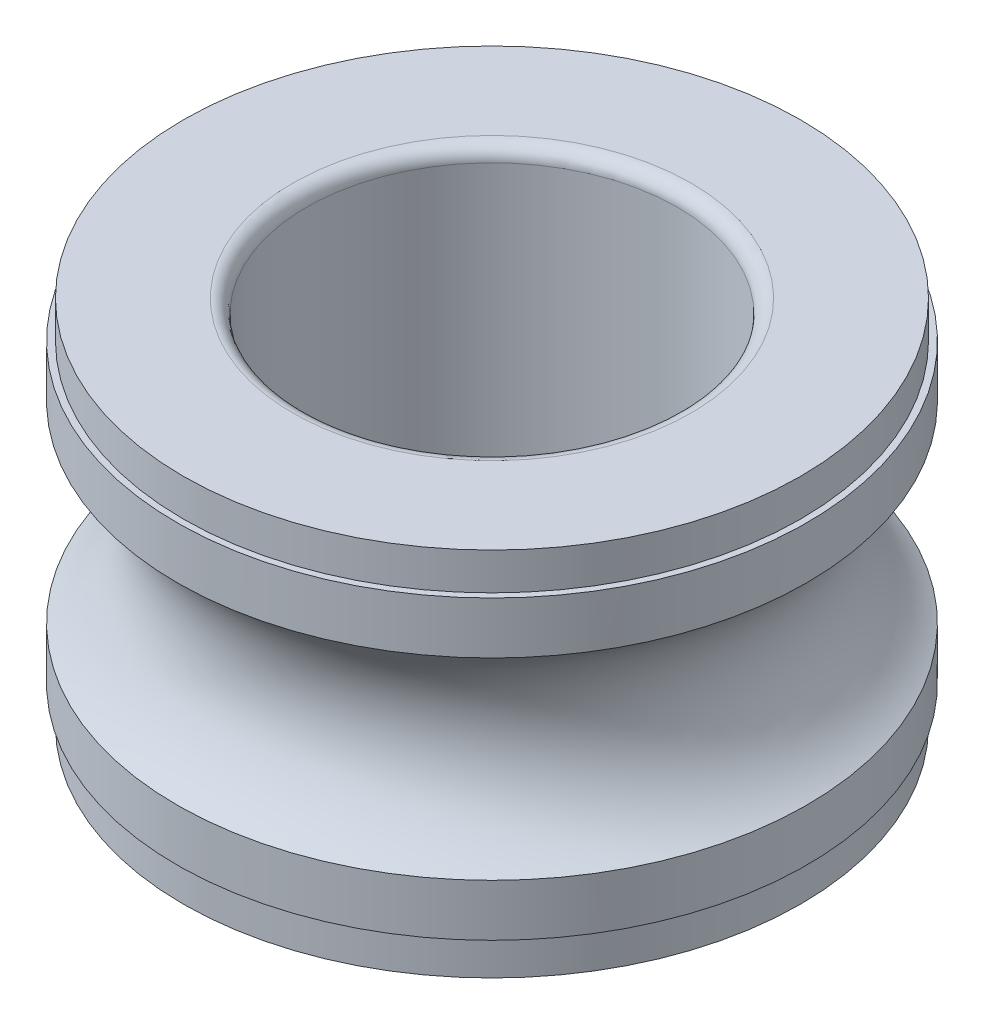
ISO-10303-21;
HEADER;
FILE_DESCRIPTION(('STEP AP214'),'2;1');
FILE_NAME('part.step','',(''),(''),'','','');
FILE_SCHEMA(('AUTOMOTIVE_DESIGN { 1 0 10303 214 1 1 1 1 }'));
ENDSEC;
DATA;
#1=APPLICATION_CONTEXT('core data for automotive mechanical design processes');
#2=APPLICATION_PROTOCOL_DEFINITION('international standard','automotive_design',2000,#1);
#3=PRODUCT_CONTEXT('',#1,'mechanical');
#4=PRODUCT('Part','Part','',(#3));
#5=PRODUCT_RELATED_PRODUCT_CATEGORY('part','',(#4));
#6=PRODUCT_DEFINITION_FORMATION('','',#4);
#7=PRODUCT_DEFINITION_CONTEXT('part definition',#1,'design');
#8=PRODUCT_DEFINITION('design','',#6,#7);
#9=PRODUCT_DEFINITION_SHAPE('','',#8);
#10=(LENGTH_UNIT() NAMED_UNIT(*) SI_UNIT(.MILLI.,.METRE.));
#11=(NAMED_UNIT(*) PLANE_ANGLE_UNIT() SI_UNIT($,.RADIAN.));
#12=(NAMED_UNIT(*) SI_UNIT($,.STERADIAN.) SOLID_ANGLE_UNIT());
#13=UNCERTAINTY_MEASURE_WITH_UNIT(LENGTH_MEASURE(1.E-05),#10,'distance_accuracy_value','');
#14=(GEOMETRIC_REPRESENTATION_CONTEXT(3) GLOBAL_UNCERTAINTY_ASSIGNED_CONTEXT((#13)) GLOBAL_UNIT_ASSIGNED_CONTEXT((#10,
#11,#12)) REPRESENTATION_CONTEXT('',''));
#15=CARTESIAN_POINT('',(0.,0.,0.));
#16=DIRECTION('',(0.,0.,1.));
#17=DIRECTION('',(1.,0.,0.));
#18=AXIS2_PLACEMENT_3D('',#15,#16,#17);
#19=CARTESIAN_POINT('',(0.,-4.,0.));
#20=DIRECTION('',(0.,1.,0.));
#21=DIRECTION('',(0.,0.,1.));
#22=AXIS2_PLACEMENT_3D('',#19,#20,#21);
#23=CYLINDRICAL_SURFACE('',#22,4.);
#24=CARTESIAN_POINT('',(0.,-0.3,0.));
#25=DIRECTION('',(0.,1.,0.));
#26=DIRECTION('',(0.,0.,1.));
#27=AXIS2_PLACEMENT_3D('',#24,#25,#26);
#28=CIRCLE('',#27,4.);
#29=CARTESIAN_POINT('',(0.,-0.3,-4.));
#30=VERTEX_POINT('',#29);
#31=EDGE_CURVE('E11',#30,#30,#28,.T.);
#32=ORIENTED_EDGE('',*,*,#31,.T.);
#33=EDGE_LOOP('',(#32));
#34=FACE_BOUND('',#33,.T.);
#35=CARTESIAN_POINT('',(0.,-7.7,0.));
#36=DIRECTION('',(0.,1.,0.));
#37=DIRECTION('',(0.,0.,1.));
#38=AXIS2_PLACEMENT_3D('',#35,#36,#37);
#39=CIRCLE('',#38,4.);
#40=CARTESIAN_POINT('',(0.,-7.7,-4.));
#41=VERTEX_POINT('',#40);
#42=EDGE_CURVE('E28',#41,#41,#39,.T.);
#43=ORIENTED_EDGE('',*,*,#42,.F.);
#44=EDGE_LOOP('',(#43));
#45=FACE_BOUND('',#44,.T.);
#46=ADVANCED_FACE('F17',(#34,#45),#23,.F.);
#47=CARTESIAN_POINT('',(0.,-7.7,0.));
#48=DIRECTION('',(0.,1.,0.));
#49=DIRECTION('',(0.,0.,1.));
#50=AXIS2_PLACEMENT_3D('',#47,#48,#49);
#51=TOROIDAL_SURFACE('',#50,4.3,0.3);
#52=ORIENTED_EDGE('',*,*,#42,.T.);
#53=EDGE_LOOP('',(#52));
#54=FACE_BOUND('',#53,.T.);
#55=CARTESIAN_POINT('',(0.,-8.,0.));
#56=DIRECTION('',(0.,1.,0.));
#57=DIRECTION('',(0.,0.,1.));
#58=AXIS2_PLACEMENT_3D('',#55,#56,#57);
#59=CIRCLE('',#58,4.3);
#60=CARTESIAN_POINT('',(0.,-8.,-4.3));
#61=VERTEX_POINT('',#60);
#62=EDGE_CURVE('E113',#61,#61,#59,.T.);
#63=ORIENTED_EDGE('',*,*,#62,.F.);
#64=EDGE_LOOP('',(#63));
#65=FACE_BOUND('',#64,.T.);
#66=ADVANCED_FACE('F162',(#54,#65),#51,.T.);
#67=CARTESIAN_POINT('',(0.,-0.3,0.));
#68=DIRECTION('',(0.,1.,0.));
#69=DIRECTION('',(0.,0.,1.));
#70=AXIS2_PLACEMENT_3D('',#67,#68,#69);
#71=TOROIDAL_SURFACE('',#70,4.3,0.3);
#72=CARTESIAN_POINT('',(0.,0.,0.));
#73=DIRECTION('',(0.,1.,0.));
#74=DIRECTION('',(0.,0.,1.));
#75=AXIS2_PLACEMENT_3D('',#72,#73,#74);
#76=CIRCLE('',#75,4.3);
#77=CARTESIAN_POINT('',(0.,0.,-4.3));
#78=VERTEX_POINT('',#77);
#79=EDGE_CURVE('E21',#78,#78,#76,.T.);
#80=ORIENTED_EDGE('',*,*,#79,.T.);
#81=EDGE_LOOP('',(#80));
#82=FACE_BOUND('',#81,.T.);
#83=ORIENTED_EDGE('',*,*,#31,.F.);
#84=EDGE_LOOP('',(#83));
#85=FACE_BOUND('',#84,.T.);
#86=ADVANCED_FACE('F126',(#82,#85),#71,.T.);
#87=CARTESIAN_POINT('',(0.,-8.,5.482));
#88=DIRECTION('',(0.,-1.,0.));
#89=DIRECTION('',(-1.,0.,0.));
#90=AXIS2_PLACEMENT_3D('',#87,#88,#89);
#91=PLANE('',#90);
#92=CARTESIAN_POINT('',(0.,-8.,0.));
#93=DIRECTION('',(0.,1.,0.));
#94=DIRECTION('',(0.,0.,1.));
#95=AXIS2_PLACEMENT_3D('',#92,#93,#94);
#96=CIRCLE('',#95,6.664);
#97=CARTESIAN_POINT('',(0.,-8.,-6.664));
#98=VERTEX_POINT('',#97);
#99=EDGE_CURVE('E106',#98,#98,#96,.T.);
#100=ORIENTED_EDGE('',*,*,#99,.F.);
#101=EDGE_LOOP('',(#100));
#102=FACE_BOUND('',#101,.T.);
#103=ORIENTED_EDGE('',*,*,#62,.T.);
#104=EDGE_LOOP('',(#103));
#105=FACE_BOUND('',#104,.T.);
#106=ADVANCED_FACE('F123',(#102,#105),#91,.T.);
#107=CARTESIAN_POINT('',(0.,0.,5.482));
#108=DIRECTION('',(0.,1.,0.));
#109=DIRECTION('',(1.,0.,0.));
#110=AXIS2_PLACEMENT_3D('',#107,#108,#109);
#111=PLANE('',#110);
#112=ORIENTED_EDGE('',*,*,#79,.F.);
#113=EDGE_LOOP('',(#112));
#114=FACE_BOUND('',#113,.T.);
#115=CARTESIAN_POINT('',(0.,0.,0.));
#116=DIRECTION('',(0.,1.,0.));
#117=DIRECTION('',(0.,0.,1.));
#118=AXIS2_PLACEMENT_3D('',#115,#116,#117);
#119=CIRCLE('',#118,6.664);
#120=CARTESIAN_POINT('',(0.,0.,-6.664));
#121=VERTEX_POINT('',#120);
#122=EDGE_CURVE('E110',#121,#121,#119,.T.);
#123=ORIENTED_EDGE('',*,*,#122,.T.);
#124=EDGE_LOOP('',(#123));
#125=FACE_BOUND('',#124,.T.);
#126=ADVANCED_FACE('F19',(#114,#125),#111,.T.);
#127=CARTESIAN_POINT('',(0.,-7.6,0.));
#128=DIRECTION('',(0.,1.,0.));
#129=DIRECTION('',(0.,0.,1.));
#130=AXIS2_PLACEMENT_3D('',#127,#128,#129);
#131=CYLINDRICAL_SURFACE('',#130,6.664);
#132=ORIENTED_EDGE('',*,*,#99,.T.);
#133=EDGE_LOOP('',(#132));
#134=FACE_BOUND('',#133,.T.);
#135=CARTESIAN_POINT('',(0.,-7.2,0.));
#136=DIRECTION('',(0.,1.,0.));
#137=DIRECTION('',(0.,0.,1.));
#138=AXIS2_PLACEMENT_3D('',#135,#136,#137);
#139=CIRCLE('',#138,6.664);
#140=CARTESIAN_POINT('',(0.,-7.2,-6.664));
#141=VERTEX_POINT('',#140);
#142=EDGE_CURVE('E87',#141,#141,#139,.T.);
#143=ORIENTED_EDGE('',*,*,#142,.F.);
#144=EDGE_LOOP('',(#143));
#145=FACE_BOUND('',#144,.T.);
#146=ADVANCED_FACE('F120',(#134,#145),#131,.T.);
#147=CARTESIAN_POINT('',(0.,-4.,0.));
#148=DIRECTION('',(0.,1.,0.));
#149=DIRECTION('',(0.,0.,1.));
#150=AXIS2_PLACEMENT_3D('',#147,#148,#149);
#151=TOROIDAL_SURFACE('',#150,8.,2.4);
#152=CARTESIAN_POINT('',(0.,-1.92153903091735,0.));
#153=DIRECTION('',(0.,1.,0.));
#154=DIRECTION('',(0.,0.,1.));
#155=AXIS2_PLACEMENT_3D('',#152,#153,#154);
#156=CIRCLE('',#155,6.8);
#157=CARTESIAN_POINT('',(6.8,-1.92153903091735,0.));
#158=VERTEX_POINT('',#157);
#159=EDGE_CURVE('E99',#158,#158,#156,.T.);
#160=ORIENTED_EDGE('',*,*,#159,.F.);
#161=EDGE_LOOP('',(#160));
#162=FACE_BOUND('',#161,.T.);
#163=CARTESIAN_POINT('',(0.,-6.07846096908265,0.));
#164=DIRECTION('',(0.,1.,0.));
#165=DIRECTION('',(0.,0.,1.));
#166=AXIS2_PLACEMENT_3D('',#163,#164,#165);
#167=CIRCLE('',#166,6.8);
#168=CARTESIAN_POINT('',(4.80832611206852,-6.07846096908265,4.80832611206852));
#169=VERTEX_POINT('',#168);
#170=EDGE_CURVE('E103',#169,#169,#167,.T.);
#171=ORIENTED_EDGE('',*,*,#170,.T.);
#172=EDGE_LOOP('',(#171));
#173=FACE_BOUND('',#172,.T.);
#174=ADVANCED_FACE('F171',(#162,#173),#151,.F.);
#175=CARTESIAN_POINT('',(0.,-0.4,0.));
#176=DIRECTION('',(0.,1.,0.));
#177=DIRECTION('',(0.,0.,1.));
#178=AXIS2_PLACEMENT_3D('',#175,#176,#177);
#179=CYLINDRICAL_SURFACE('',#178,6.664);
#180=CARTESIAN_POINT('',(0.,-0.8,0.));
#181=DIRECTION('',(0.,1.,0.));
#182=DIRECTION('',(0.,0.,1.));
#183=AXIS2_PLACEMENT_3D('',#180,#181,#182);
#184=CIRCLE('',#183,6.664);
#185=CARTESIAN_POINT('',(0.,-0.8,-6.664));
#186=VERTEX_POINT('',#185);
#187=EDGE_CURVE('E96',#186,#186,#184,.T.);
#188=ORIENTED_EDGE('',*,*,#187,.T.);
#189=EDGE_LOOP('',(#188));
#190=FACE_BOUND('',#189,.T.);
#191=ORIENTED_EDGE('',*,*,#122,.F.);
#192=EDGE_LOOP('',(#191));
#193=FACE_BOUND('',#192,.T.);
#194=ADVANCED_FACE('F143',(#190,#193),#179,.T.);
#195=CARTESIAN_POINT('',(0.,-7.2,6.732));
#196=DIRECTION('',(0.,-1.,0.));
#197=DIRECTION('',(-1.,0.,0.));
#198=AXIS2_PLACEMENT_3D('',#195,#196,#197);
#199=PLANE('',#198);
#200=CARTESIAN_POINT('',(0.,-7.2,0.));
#201=DIRECTION('',(0.,1.,0.));
#202=DIRECTION('',(0.,0.,1.));
#203=AXIS2_PLACEMENT_3D('',#200,#201,#202);
#204=CIRCLE('',#203,6.8);
#205=CARTESIAN_POINT('',(0.,-7.2,-6.8));
#206=VERTEX_POINT('',#205);
#207=EDGE_CURVE('E82',#206,#206,#204,.T.);
#208=ORIENTED_EDGE('',*,*,#207,.F.);
#209=EDGE_LOOP('',(#208));
#210=FACE_BOUND('',#209,.T.);
#211=ORIENTED_EDGE('',*,*,#142,.T.);
#212=EDGE_LOOP('',(#211));
#213=FACE_BOUND('',#212,.T.);
#214=ADVANCED_FACE('F83',(#210,#213),#199,.T.);
#215=CARTESIAN_POINT('',(0.,-6.63923048454133,0.));
#216=DIRECTION('',(0.,1.,0.));
#217=DIRECTION('',(0.,0.,1.));
#218=AXIS2_PLACEMENT_3D('',#215,#216,#217);
#219=CYLINDRICAL_SURFACE('',#218,6.8);
#220=ORIENTED_EDGE('',*,*,#207,.T.);
#221=EDGE_LOOP('',(#220));
#222=FACE_BOUND('',#221,.T.);
#223=ORIENTED_EDGE('',*,*,#170,.F.);
#224=EDGE_LOOP('',(#223));
#225=FACE_BOUND('',#224,.T.);
#226=ADVANCED_FACE('F150',(#222,#225),#219,.T.);
#227=CARTESIAN_POINT('',(0.,-0.8,6.732));
#228=DIRECTION('',(0.,1.,0.));
#229=DIRECTION('',(1.,0.,0.));
#230=AXIS2_PLACEMENT_3D('',#227,#228,#229);
#231=PLANE('',#230);
#232=ORIENTED_EDGE('',*,*,#187,.F.);
#233=EDGE_LOOP('',(#232));
#234=FACE_BOUND('',#233,.T.);
#235=CARTESIAN_POINT('',(0.,-0.8,0.));
#236=DIRECTION('',(0.,1.,0.));
#237=DIRECTION('',(0.,0.,1.));
#238=AXIS2_PLACEMENT_3D('',#235,#236,#237);
#239=CIRCLE('',#238,6.8);
#240=CARTESIAN_POINT('',(0.,-0.8,-6.8));
#241=VERTEX_POINT('',#240);
#242=EDGE_CURVE('E88',#241,#241,#239,.T.);
#243=ORIENTED_EDGE('',*,*,#242,.T.);
#244=EDGE_LOOP('',(#243));
#245=FACE_BOUND('',#244,.T.);
#246=ADVANCED_FACE('F146',(#234,#245),#231,.T.);
#247=CARTESIAN_POINT('',(0.,-1.36076951545867,0.));
#248=DIRECTION('',(0.,1.,0.));
#249=DIRECTION('',(0.,0.,1.));
#250=AXIS2_PLACEMENT_3D('',#247,#248,#249);
#251=CYLINDRICAL_SURFACE('',#250,6.8);
#252=ORIENTED_EDGE('',*,*,#159,.T.);
#253=EDGE_LOOP('',(#252));
#254=FACE_BOUND('',#253,.T.);
#255=ORIENTED_EDGE('',*,*,#242,.F.);
#256=EDGE_LOOP('',(#255));
#257=FACE_BOUND('',#256,.T.);
#258=ADVANCED_FACE('F149',(#254,#257),#251,.T.);
#259=CLOSED_SHELL('',(#46,#66,#86,#106,#126,#146,#174,#194,#214,#226,#246,#258));
#260=MANIFOLD_SOLID_BREP('B1',#259);
#261=ADVANCED_BREP_SHAPE_REPRESENTATION('',(#18,#260),#14);
#262=SHAPE_DEFINITION_REPRESENTATION(#9,#261);
ENDSEC;
END-ISO-10303-21;
